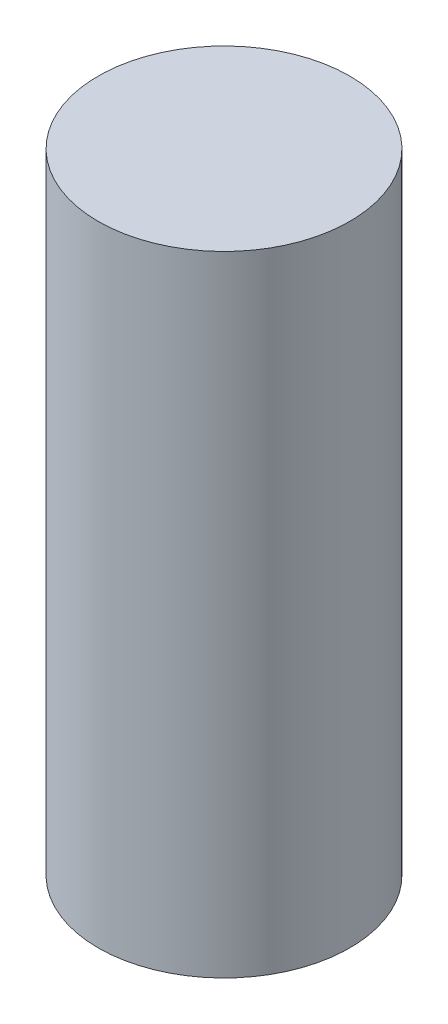
ISO-10303-21;
HEADER;
FILE_DESCRIPTION(('STEP AP214'),'2;1');
FILE_NAME('part.step','',(''),(''),'','','');
FILE_SCHEMA(('AUTOMOTIVE_DESIGN { 1 0 10303 214 1 1 1 1 }'));
ENDSEC;
DATA;
#1=APPLICATION_CONTEXT('core data for automotive mechanical design processes');
#2=APPLICATION_PROTOCOL_DEFINITION('international standard','automotive_design',2000,#1);
#3=PRODUCT_CONTEXT('',#1,'mechanical');
#4=PRODUCT('Part','Part','',(#3));
#5=PRODUCT_RELATED_PRODUCT_CATEGORY('part','',(#4));
#6=PRODUCT_DEFINITION_FORMATION('','',#4);
#7=PRODUCT_DEFINITION_CONTEXT('part definition',#1,'design');
#8=PRODUCT_DEFINITION('design','',#6,#7);
#9=PRODUCT_DEFINITION_SHAPE('','',#8);
#10=(LENGTH_UNIT() NAMED_UNIT(*) SI_UNIT(.MILLI.,.METRE.));
#11=(NAMED_UNIT(*) PLANE_ANGLE_UNIT() SI_UNIT($,.RADIAN.));
#12=(NAMED_UNIT(*) SI_UNIT($,.STERADIAN.) SOLID_ANGLE_UNIT());
#13=UNCERTAINTY_MEASURE_WITH_UNIT(LENGTH_MEASURE(1.E-05),#10,'distance_accuracy_value','');
#14=(GEOMETRIC_REPRESENTATION_CONTEXT(3) GLOBAL_UNCERTAINTY_ASSIGNED_CONTEXT((#13)) GLOBAL_UNIT_ASSIGNED_CONTEXT((#10,
#11,#12)) REPRESENTATION_CONTEXT('',''));
#15=CARTESIAN_POINT('',(0.,0.,0.));
#16=DIRECTION('',(0.,0.,1.));
#17=DIRECTION('',(1.,0.,0.));
#18=AXIS2_PLACEMENT_3D('',#15,#16,#17);
#19=CARTESIAN_POINT('',(0.,0.,0.));
#20=DIRECTION('',(0.,-1.,0.));
#21=DIRECTION('',(0.,0.,-1.));
#22=AXIS2_PLACEMENT_3D('',#19,#20,#21);
#23=PLANE('',#22);
#24=CARTESIAN_POINT('',(0.,0.,0.));
#25=DIRECTION('',(0.,-1.,0.));
#26=DIRECTION('',(0.,0.,-1.));
#27=AXIS2_PLACEMENT_3D('',#24,#25,#26);
#28=CIRCLE('',#27,6.);
#29=CARTESIAN_POINT('',(0.,0.,-6.));
#30=VERTEX_POINT('',#29);
#31=EDGE_CURVE('E10',#30,#30,#28,.T.);
#32=ORIENTED_EDGE('',*,*,#31,.T.);
#33=EDGE_LOOP('',(#32));
#34=FACE_BOUND('',#33,.T.);
#35=ADVANCED_FACE('F37',(#34),#23,.T.);
#36=CARTESIAN_POINT('',(0.,0.,0.));
#37=DIRECTION('',(0.,-1.,0.));
#38=DIRECTION('',(0.,0.,-1.));
#39=AXIS2_PLACEMENT_3D('',#36,#37,#38);
#40=CYLINDRICAL_SURFACE('',#39,6.);
#41=CARTESIAN_POINT('',(0.,30.,0.));
#42=DIRECTION('',(0.,-1.,0.));
#43=DIRECTION('',(0.,0.,-1.));
#44=AXIS2_PLACEMENT_3D('',#41,#42,#43);
#45=CIRCLE('',#44,6.);
#46=CARTESIAN_POINT('',(0.,30.,-6.));
#47=VERTEX_POINT('',#46);
#48=EDGE_CURVE('E43',#47,#47,#45,.T.);
#49=ORIENTED_EDGE('',*,*,#48,.T.);
#50=EDGE_LOOP('',(#49));
#51=FACE_BOUND('',#50,.T.);
#52=ORIENTED_EDGE('',*,*,#31,.F.);
#53=EDGE_LOOP('',(#52));
#54=FACE_BOUND('',#53,.T.);
#55=ADVANCED_FACE('F49',(#51,#54),#40,.T.);
#56=CARTESIAN_POINT('',(6.,30.,0.));
#57=DIRECTION('',(0.,1.,0.));
#58=DIRECTION('',(0.,0.,1.));
#59=AXIS2_PLACEMENT_3D('',#56,#57,#58);
#60=PLANE('',#59);
#61=ORIENTED_EDGE('',*,*,#48,.F.);
#62=EDGE_LOOP('',(#61));
#63=FACE_BOUND('',#62,.T.);
#64=ADVANCED_FACE('F52',(#63),#60,.T.);
#65=CLOSED_SHELL('',(#35,#55,#64));
#66=MANIFOLD_SOLID_BREP('B2',#65);
#67=ADVANCED_BREP_SHAPE_REPRESENTATION('',(#18,#66),#14);
#68=SHAPE_DEFINITION_REPRESENTATION(#9,#67);
ENDSEC;
END-ISO-10303-21;
